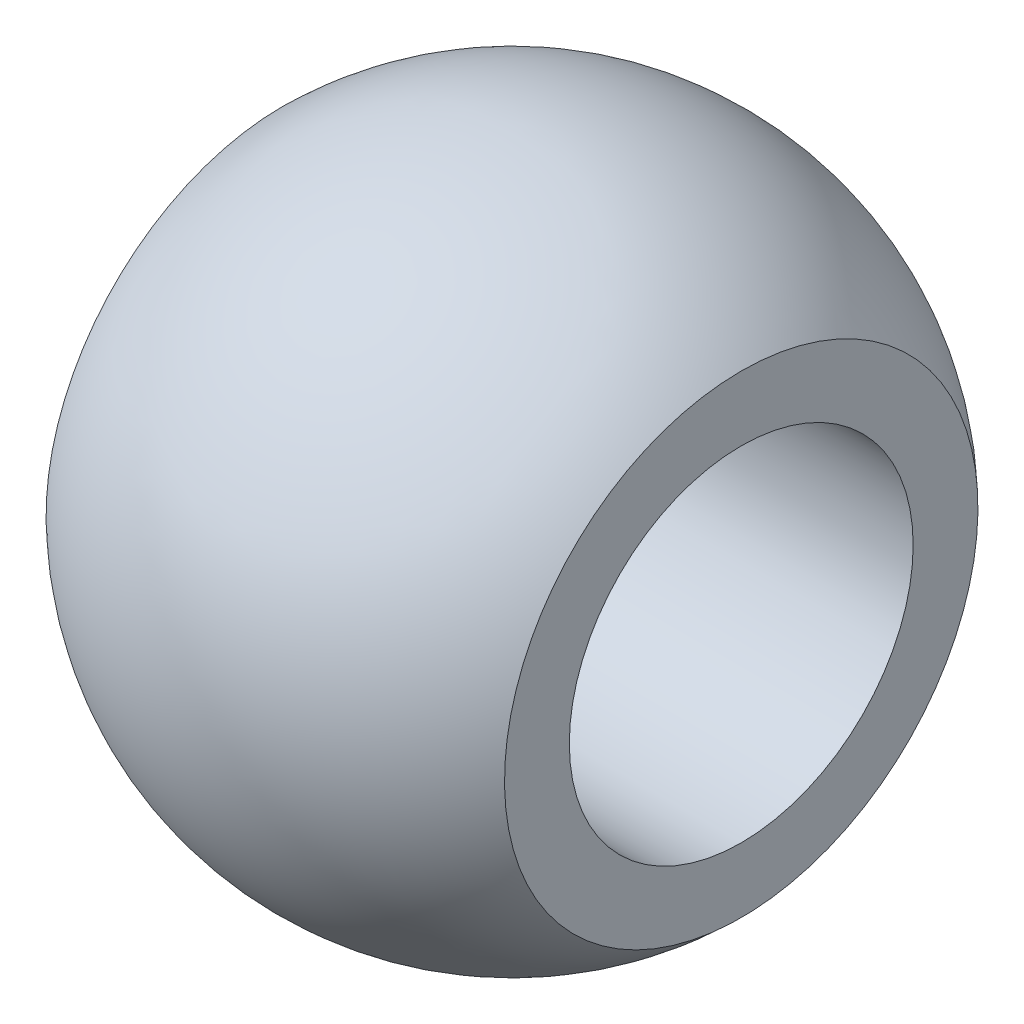
ISO-10303-21;
HEADER;
FILE_DESCRIPTION(('STEP AP214'),'2;1');
FILE_NAME('part.step','',(''),(''),'','','');
FILE_SCHEMA(('AUTOMOTIVE_DESIGN { 1 0 10303 214 1 1 1 1 }'));
ENDSEC;
DATA;
#1=APPLICATION_CONTEXT('core data for automotive mechanical design processes');
#2=APPLICATION_PROTOCOL_DEFINITION('international standard','automotive_design',2000,#1);
#3=PRODUCT_CONTEXT('',#1,'mechanical');
#4=PRODUCT('Part','Part','',(#3));
#5=PRODUCT_RELATED_PRODUCT_CATEGORY('part','',(#4));
#6=PRODUCT_DEFINITION_FORMATION('','',#4);
#7=PRODUCT_DEFINITION_CONTEXT('part definition',#1,'design');
#8=PRODUCT_DEFINITION('design','',#6,#7);
#9=PRODUCT_DEFINITION_SHAPE('','',#8);
#10=(LENGTH_UNIT() NAMED_UNIT(*) SI_UNIT(.MILLI.,.METRE.));
#11=(NAMED_UNIT(*) PLANE_ANGLE_UNIT() SI_UNIT($,.RADIAN.));
#12=(NAMED_UNIT(*) SI_UNIT($,.STERADIAN.) SOLID_ANGLE_UNIT());
#13=UNCERTAINTY_MEASURE_WITH_UNIT(LENGTH_MEASURE(1.E-05),#10,'distance_accuracy_value','');
#14=(GEOMETRIC_REPRESENTATION_CONTEXT(3) GLOBAL_UNCERTAINTY_ASSIGNED_CONTEXT((#13)) GLOBAL_UNIT_ASSIGNED_CONTEXT((#10,
#11,#12)) REPRESENTATION_CONTEXT('',''));
#15=CARTESIAN_POINT('',(0.,0.,0.));
#16=DIRECTION('',(0.,0.,1.));
#17=DIRECTION('',(1.,0.,0.));
#18=AXIS2_PLACEMENT_3D('',#15,#16,#17);
#19=CARTESIAN_POINT('',(6.35,-7.74250015995644,0.));
#20=DIRECTION('',(-1.,0.,0.));
#21=DIRECTION('',(0.,0.,1.));
#22=AXIS2_PLACEMENT_3D('',#19,#20,#21);
#23=PLANE('',#22);
#24=CARTESIAN_POINT('',(6.35,0.,0.));
#25=DIRECTION('',(-1.,0.,0.));
#26=DIRECTION('',(0.,0.,1.));
#27=AXIS2_PLACEMENT_3D('',#24,#25,#26);
#28=CIRCLE('',#27,6.55745118286251);
#29=CARTESIAN_POINT('',(6.35,6.55745118286251,0.));
#30=VERTEX_POINT('',#29);
#31=EDGE_CURVE('E10',#30,#30,#28,.T.);
#32=ORIENTED_EDGE('',*,*,#31,.F.);
#33=EDGE_LOOP('',(#32));
#34=FACE_BOUND('',#33,.T.);
#35=CARTESIAN_POINT('',(6.35,0.,0.));
#36=DIRECTION('',(-1.,0.,0.));
#37=DIRECTION('',(0.,0.,1.));
#38=AXIS2_PLACEMENT_3D('',#35,#36,#37);
#39=CIRCLE('',#38,4.7625);
#40=CARTESIAN_POINT('',(6.35,0.,4.7625));
#41=VERTEX_POINT('',#40);
#42=EDGE_CURVE('E46',#41,#41,#39,.T.);
#43=ORIENTED_EDGE('',*,*,#42,.T.);
#44=EDGE_LOOP('',(#43));
#45=FACE_BOUND('',#44,.T.);
#46=ADVANCED_FACE('F32',(#34,#45),#23,.F.);
#47=CARTESIAN_POINT('',(0.,0.,0.));
#48=DIRECTION('',(-1.,0.,0.));
#49=DIRECTION('',(0.,1.,0.));
#50=AXIS2_PLACEMENT_3D('',#47,#48,#49);
#51=SPHERICAL_SURFACE('',#50,9.128125);
#52=CARTESIAN_POINT('',(-6.35,0.,0.));
#53=DIRECTION('',(-1.,0.,0.));
#54=DIRECTION('',(0.,0.,1.));
#55=AXIS2_PLACEMENT_3D('',#52,#53,#54);
#56=CIRCLE('',#55,6.55745118286251);
#57=CARTESIAN_POINT('',(-6.35,6.55745118286251,0.));
#58=VERTEX_POINT('',#57);
#59=EDGE_CURVE('E38',#58,#58,#56,.T.);
#60=CARTESIAN_POINT('',(-6.35,6.55745118286251,0.));
#61=CARTESIAN_POINT('',(-6.24490137940979,6.6592289694432,0.));
#62=CARTESIAN_POINT('',(-6.13735211145698,6.75847569781155,0.));
#63=CARTESIAN_POINT('',(-5.91760935032719,6.95168725590269,0.));
#64=CARTESIAN_POINT('',(-5.8054158571502,7.04565208562548,0.));
#65=CARTESIAN_POINT('',(-5.57664171507309,7.22808006420465,0.));
#66=CARTESIAN_POINT('',(-5.46006106617297,7.31654321306103,0.));
#67=CARTESIAN_POINT('',(-5.22278269967344,7.48776403641932,0.));
#68=CARTESIAN_POINT('',(-5.10208498207404,7.57052171092124,0.));
#69=CARTESIAN_POINT('',(-4.85685131115332,7.73014010384804,0.));
#70=CARTESIAN_POINT('',(-4.73231535783201,7.80700082227292,0.));
#71=CARTESIAN_POINT('',(-4.47969312714822,7.95464768716771,0.));
#72=CARTESIAN_POINT('',(-4.35160684978573,8.02543383363761,0.));
#73=CARTESIAN_POINT('',(-4.09218003402723,8.16076791733683,0.));
#74=CARTESIAN_POINT('',(-3.96083949563121,8.22531585456614,0.));
#75=CARTESIAN_POINT('',(-3.69520775794851,8.34802431914219,0.));
#76=CARTESIAN_POINT('',(-3.56091655866183,8.40618484648892,0.));
#77=CARTESIAN_POINT('',(-3.28969391589562,8.51598405080033,0.));
#78=CARTESIAN_POINT('',(-3.15276247241608,8.56762272776501,0.));
#79=CARTESIAN_POINT('',(-2.87657586201845,8.66425886744734,0.));
#80=CARTESIAN_POINT('',(-2.73732069510035,8.70925633016499,0.));
#81=CARTESIAN_POINT('',(-2.4568085296407,8.79250602850023,0.));
#82=CARTESIAN_POINT('',(-2.31555153109916,8.83075826411783,0.));
#83=CARTESIAN_POINT('',(-2.03136222156909,8.90042908725161,0.));
#84=CARTESIAN_POINT('',(-1.88842991058058,8.93184767476779,0.));
#85=CARTESIAN_POINT('',(-1.6012203678401,8.98777857682625,0.));
#86=CARTESIAN_POINT('',(-1.45694313608814,9.01229089136852,0.));
#87=CARTESIAN_POINT('',(-1.16737725232846,9.05435258663926,0.));
#88=CARTESIAN_POINT('',(-1.02208860032074,9.07190196736773,0.));
#89=CARTESIAN_POINT('',(-0.730835714479557,9.09999722916871,0.));
#90=CARTESIAN_POINT('',(-0.584871480646085,9.11054311024121,0.));
#91=CARTESIAN_POINT('',(-0.292604831208408,9.12460699565685,0.));
#92=CARTESIAN_POINT('',(-0.146302415604204,9.128125,0.));
#93=CARTESIAN_POINT('',(0.146302415604204,9.128125,0.));
#94=CARTESIAN_POINT('',(0.292604831208408,9.12460699565685,0.));
#95=CARTESIAN_POINT('',(0.584871480646085,9.11054311024121,0.));
#96=CARTESIAN_POINT('',(0.730835714479557,9.09999722916871,0.));
#97=CARTESIAN_POINT('',(1.02208860032074,9.07190196736773,0.));
#98=CARTESIAN_POINT('',(1.16737725232846,9.05435258663926,0.));
#99=CARTESIAN_POINT('',(1.45694313608814,9.01229089136852,0.));
#100=CARTESIAN_POINT('',(1.6012203678401,8.98777857682625,0.));
#101=CARTESIAN_POINT('',(1.88842991058058,8.93184767476779,0.));
#102=CARTESIAN_POINT('',(2.03136222156909,8.90042908725161,0.));
#103=CARTESIAN_POINT('',(2.31555153109916,8.83075826411783,0.));
#104=CARTESIAN_POINT('',(2.45680852964071,8.79250602850023,0.));
#105=CARTESIAN_POINT('',(2.73732069510035,8.70925633016499,0.));
#106=CARTESIAN_POINT('',(2.87657586201845,8.66425886744734,0.));
#107=CARTESIAN_POINT('',(3.15276247241608,8.56762272776501,0.));
#108=CARTESIAN_POINT('',(3.28969391589561,8.51598405080033,0.));
#109=CARTESIAN_POINT('',(3.56091655866183,8.40618484648892,0.));
#110=CARTESIAN_POINT('',(3.69520775794851,8.34802431914219,0.));
#111=CARTESIAN_POINT('',(3.96083949563121,8.22531585456614,0.));
#112=CARTESIAN_POINT('',(4.09218003402723,8.16076791733683,0.));
#113=CARTESIAN_POINT('',(4.35160684978573,8.02543383363762,0.));
#114=CARTESIAN_POINT('',(4.47969312714822,7.95464768716771,0.));
#115=CARTESIAN_POINT('',(4.73231535783201,7.80700082227292,0.));
#116=CARTESIAN_POINT('',(4.85685131115332,7.73014010384804,0.));
#117=CARTESIAN_POINT('',(5.10208498207404,7.57052171092124,0.));
#118=CARTESIAN_POINT('',(5.22278269967344,7.48776403641932,0.));
#119=CARTESIAN_POINT('',(5.46006106617297,7.31654321306103,0.));
#120=CARTESIAN_POINT('',(5.57664171507309,7.22808006420465,0.));
#121=CARTESIAN_POINT('',(5.8054158571502,7.04565208562548,0.));
#122=CARTESIAN_POINT('',(5.91760935032719,6.95168725590269,0.));
#123=CARTESIAN_POINT('',(6.13735211145698,6.75847569781155,0.));
#124=CARTESIAN_POINT('',(6.2449013794098,6.6592289694432,0.));
#125=CARTESIAN_POINT('',(6.35,6.55745118286251,0.));
#126=B_SPLINE_CURVE_WITH_KNOTS('',3,(#60,#61,#62,#63,#64,#65,#66,#67,#68,#69,#70,#71,#72,#73,
#74,#75,#76,#77,#78,#79,#80,#81,#82,#83,#84,#85,#86,#87,#88,#89,#90,#91,#92,#93,#94,#95,#96,#97,
#98,#99,#100,#101,#102,#103,#104,#105,#106,#107,#108,#109,#110,#111,#112,#113,#114,#115,#116,
#117,#118,#119,#120,#121,#122,#123,#124,#125),.UNSPECIFIED.,.F.,.F.,(4,2,2,2,2,2,2,2,2,2,2,2,2,
2,2,2,2,2,2,2,2,2,2,2,2,2,2,2,2,2,2,2,4),(0.,0.438864980203729,0.877729960407456,
1.31659494061118,1.75545992081491,2.19432490101864,2.63318988122237,3.0720548614261,
3.51091984162983,3.94978482183355,4.38864980203728,4.82751478224101,5.26637976244474,
5.70524474264847,6.14410972285219,6.58297470305592,7.02183968325965,7.46070466346338,
7.89956964366711,8.33843462387084,8.77729960407456,9.21616458427829,9.65502956448202,
10.0938945446857,10.5327595248895,10.9716245050932,11.4104894852969,11.8493544655007,
12.2882194457044,12.7270844259081,13.1659494061118,13.6048143863156,14.0436793665193),.UNSPECIFIED.);
#127=EDGE_CURVE('BSEAM61',#58,#30,#126,.T.);
#128=ORIENTED_EDGE('',*,*,#59,.F.);
#129=ORIENTED_EDGE('',*,*,#31,.T.);
#130=ORIENTED_EDGE('',*,*,#127,.T.);
#131=ORIENTED_EDGE('',*,*,#127,.F.);
#132=EDGE_LOOP('',(#128,#130,#129,#131));
#133=FACE_BOUND('',#132,.T.);
#134=ADVANCED_FACE('F61',(#133),#51,.T.);
#135=CARTESIAN_POINT('',(-6.35,-7.74250015995644,0.));
#136=DIRECTION('',(-1.,0.,0.));
#137=DIRECTION('',(0.,0.,1.));
#138=AXIS2_PLACEMENT_3D('',#135,#136,#137);
#139=PLANE('',#138);
#140=ORIENTED_EDGE('',*,*,#59,.T.);
#141=EDGE_LOOP('',(#140));
#142=FACE_BOUND('',#141,.T.);
#143=CARTESIAN_POINT('',(-6.35,0.,0.));
#144=DIRECTION('',(-1.,0.,0.));
#145=DIRECTION('',(0.,0.,1.));
#146=AXIS2_PLACEMENT_3D('',#143,#144,#145);
#147=CIRCLE('',#146,4.7625);
#148=CARTESIAN_POINT('',(-6.35,0.,4.7625));
#149=VERTEX_POINT('',#148);
#150=EDGE_CURVE('E42',#149,#149,#147,.T.);
#151=ORIENTED_EDGE('',*,*,#150,.F.);
#152=EDGE_LOOP('',(#151));
#153=FACE_BOUND('',#152,.T.);
#154=ADVANCED_FACE('F56',(#142,#153),#139,.T.);
#155=CARTESIAN_POINT('',(-9.128125,0.,0.));
#156=DIRECTION('',(-1.,0.,0.));
#157=DIRECTION('',(0.,0.,1.));
#158=AXIS2_PLACEMENT_3D('',#155,#156,#157);
#159=CYLINDRICAL_SURFACE('',#158,4.7625);
#160=ORIENTED_EDGE('',*,*,#42,.F.);
#161=EDGE_LOOP('',(#160));
#162=FACE_BOUND('',#161,.T.);
#163=ORIENTED_EDGE('',*,*,#150,.T.);
#164=EDGE_LOOP('',(#163));
#165=FACE_BOUND('',#164,.T.);
#166=ADVANCED_FACE('F53',(#162,#165),#159,.F.);
#167=CLOSED_SHELL('',(#46,#134,#154,#166));
#168=MANIFOLD_SOLID_BREP('B2',#167);
#169=ADVANCED_BREP_SHAPE_REPRESENTATION('',(#18,#168),#14);
#170=SHAPE_DEFINITION_REPRESENTATION(#9,#169);
ENDSEC;
END-ISO-10303-21;
